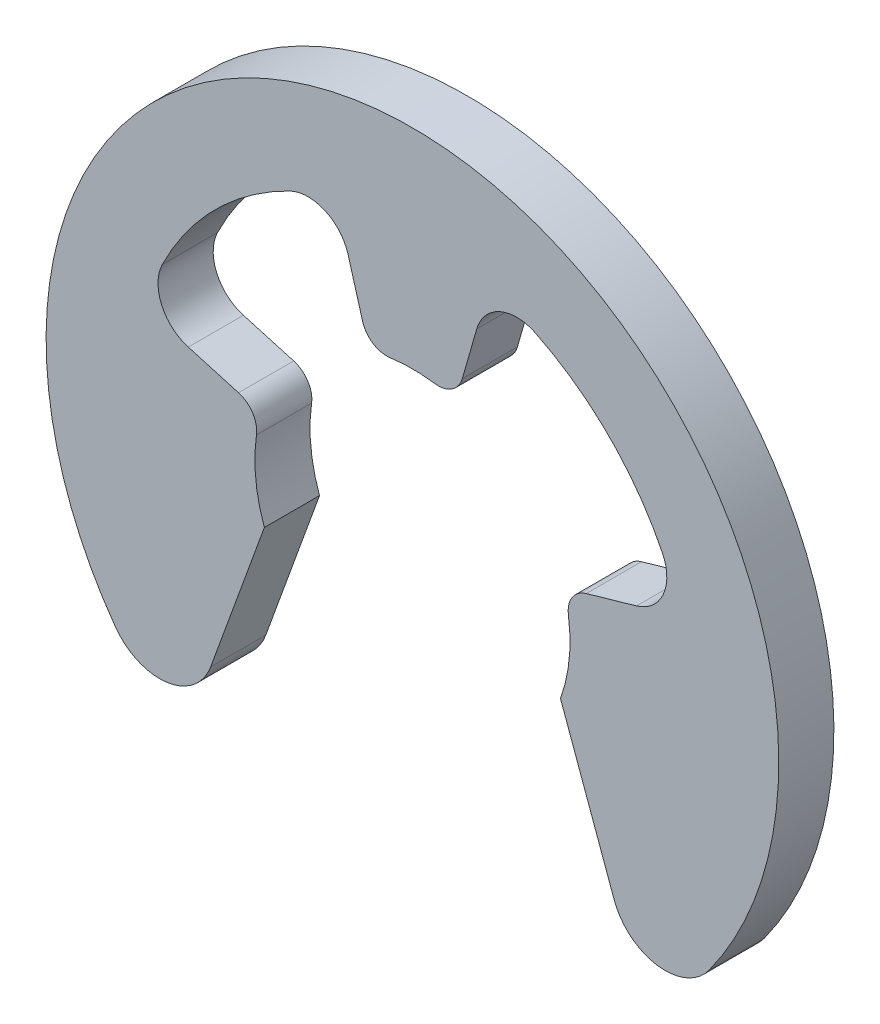
ISO-10303-21;
HEADER;
FILE_DESCRIPTION(('STEP AP214'),'2;1');
FILE_NAME('part.step','',(''),(''),'','','');
FILE_SCHEMA(('AUTOMOTIVE_DESIGN { 1 0 10303 214 1 1 1 1 }'));
ENDSEC;
DATA;
#1=APPLICATION_CONTEXT('core data for automotive mechanical design processes');
#2=APPLICATION_PROTOCOL_DEFINITION('international standard','automotive_design',2000,#1);
#3=PRODUCT_CONTEXT('',#1,'mechanical');
#4=PRODUCT('Part','Part','',(#3));
#5=PRODUCT_RELATED_PRODUCT_CATEGORY('part','',(#4));
#6=PRODUCT_DEFINITION_FORMATION('','',#4);
#7=PRODUCT_DEFINITION_CONTEXT('part definition',#1,'design');
#8=PRODUCT_DEFINITION('design','',#6,#7);
#9=PRODUCT_DEFINITION_SHAPE('','',#8);
#10=(LENGTH_UNIT() NAMED_UNIT(*) SI_UNIT(.MILLI.,.METRE.));
#11=(NAMED_UNIT(*) PLANE_ANGLE_UNIT() SI_UNIT($,.RADIAN.));
#12=(NAMED_UNIT(*) SI_UNIT($,.STERADIAN.) SOLID_ANGLE_UNIT());
#13=UNCERTAINTY_MEASURE_WITH_UNIT(LENGTH_MEASURE(1.E-05),#10,'distance_accuracy_value','');
#14=(GEOMETRIC_REPRESENTATION_CONTEXT(3) GLOBAL_UNCERTAINTY_ASSIGNED_CONTEXT((#13)) GLOBAL_UNIT_ASSIGNED_CONTEXT((#10,
#11,#12)) REPRESENTATION_CONTEXT('',''));
#15=CARTESIAN_POINT('',(0.,0.,0.));
#16=DIRECTION('',(0.,0.,1.));
#17=DIRECTION('',(1.,0.,0.));
#18=AXIS2_PLACEMENT_3D('',#15,#16,#17);
#19=CARTESIAN_POINT('',(0.,0.,0.));
#20=DIRECTION('',(0.,0.,1.));
#21=DIRECTION('',(1.,0.,0.));
#22=AXIS2_PLACEMENT_3D('',#19,#20,#21);
#23=CYLINDRICAL_SURFACE('',#22,2.);
#24=CARTESIAN_POINT('',(0.,0.,0.7));
#25=DIRECTION('',(0.,0.,-1.));
#26=DIRECTION('',(-1.,0.,0.));
#27=AXIS2_PLACEMENT_3D('',#24,#25,#26);
#28=CIRCLE('',#27,2.);
#29=CARTESIAN_POINT('',(-0.282316824021943,1.9799740429799,0.7));
#30=VERTEX_POINT('',#29);
#31=CARTESIAN_POINT('',(0.282316824021944,1.9799740429799,0.7));
#32=VERTEX_POINT('',#31);
#33=EDGE_CURVE('E216',#30,#32,#28,.T.);
#34=ORIENTED_EDGE('',*,*,#33,.F.);
#35=DIRECTION('',(0.,0.,1.));
#36=VECTOR('',#35,1.);
#37=CARTESIAN_POINT('',(-0.282316824021943,1.9799740429799,0.));
#38=LINE('',#37,#36);
#39=CARTESIAN_POINT('',(-0.282316824021943,1.9799740429799,0.));
#40=VERTEX_POINT('',#39);
#41=EDGE_CURVE('E11',#40,#30,#38,.T.);
#42=ORIENTED_EDGE('',*,*,#41,.F.);
#43=CARTESIAN_POINT('',(0.,0.,0.));
#44=DIRECTION('',(0.,0.,-1.));
#45=DIRECTION('',(-1.,0.,0.));
#46=AXIS2_PLACEMENT_3D('',#43,#44,#45);
#47=CIRCLE('',#46,2.);
#48=CARTESIAN_POINT('',(0.282316824021944,1.9799740429799,0.));
#49=VERTEX_POINT('',#48);
#50=EDGE_CURVE('E278',#40,#49,#47,.T.);
#51=ORIENTED_EDGE('',*,*,#50,.T.);
#52=DIRECTION('',(0.,0.,1.));
#53=VECTOR('',#52,1.);
#54=CARTESIAN_POINT('',(0.282316824021944,1.9799740429799,0.));
#55=LINE('',#54,#53);
#56=EDGE_CURVE('E38',#49,#32,#55,.T.);
#57=ORIENTED_EDGE('',*,*,#56,.T.);
#58=EDGE_LOOP('',(#34,#42,#51,#57));
#59=FACE_BOUND('',#58,.T.);
#60=ADVANCED_FACE('F35',(#59),#23,.F.);
#61=CARTESIAN_POINT('',(-0.327205199041433,2.2947899158137,0.));
#62=DIRECTION('',(0.,0.,1.));
#63=DIRECTION('',(1.,0.,0.));
#64=AXIS2_PLACEMENT_3D('',#61,#62,#63);
#65=CYLINDRICAL_SURFACE('',#64,0.317999999999998);
#66=CARTESIAN_POINT('',(-0.327205199041433,2.2947899158137,0.7));
#67=DIRECTION('',(0.,0.,1.));
#68=DIRECTION('',(1.,0.,0.));
#69=AXIS2_PLACEMENT_3D('',#66,#67,#68);
#70=CIRCLE('',#69,0.317999999999998);
#71=CARTESIAN_POINT('',(-0.632886418349818,2.2071372366639,0.7));
#72=VERTEX_POINT('',#71);
#73=EDGE_CURVE('E276',#72,#30,#70,.T.);
#74=ORIENTED_EDGE('',*,*,#73,.F.);
#75=DIRECTION('',(0.,0.,1.));
#76=VECTOR('',#75,1.);
#77=CARTESIAN_POINT('',(-0.632886418349818,2.2071372366639,0.));
#78=LINE('',#77,#76);
#79=CARTESIAN_POINT('',(-0.632886418349818,2.2071372366639,0.));
#80=VERTEX_POINT('',#79);
#81=EDGE_CURVE('E44',#80,#72,#78,.T.);
#82=ORIENTED_EDGE('',*,*,#81,.F.);
#83=CARTESIAN_POINT('',(-0.327205199041433,2.2947899158137,0.));
#84=DIRECTION('',(0.,0.,1.));
#85=DIRECTION('',(1.,0.,0.));
#86=AXIS2_PLACEMENT_3D('',#83,#84,#85);
#87=CIRCLE('',#86,0.317999999999998);
#88=EDGE_CURVE('E206',#80,#40,#87,.T.);
#89=ORIENTED_EDGE('',*,*,#88,.T.);
#90=ORIENTED_EDGE('',*,*,#41,.T.);
#91=EDGE_LOOP('',(#74,#82,#89,#90));
#92=FACE_BOUND('',#91,.T.);
#93=ADVANCED_FACE('F318',(#92),#65,.T.);
#94=CARTESIAN_POINT('',(-0.815865574223849,2.84526138778081,0.));
#95=DIRECTION('',(-0.961261695938319,-0.275637355816998,0.));
#96=DIRECTION('',(0.275637355816998,-0.961261695938319,0.));
#97=AXIS2_PLACEMENT_3D('',#94,#95,#96);
#98=PLANE('',#97);
#99=DIRECTION('',(0.275637355816998,-0.961261695938319,0.));
#100=VECTOR('',#99,1.);
#101=CARTESIAN_POINT('',(-0.815865574223849,2.84526138778081,0.7));
#102=LINE('',#101,#100);
#103=CARTESIAN_POINT('',(-0.815865574223848,2.84526138778081,0.7));
#104=VERTEX_POINT('',#103);
#105=EDGE_CURVE('E193',#104,#72,#102,.T.);
#106=ORIENTED_EDGE('',*,*,#105,.F.);
#107=DIRECTION('',(0.,0.,1.));
#108=VECTOR('',#107,1.);
#109=CARTESIAN_POINT('',(-0.815865574223848,2.84526138778081,0.));
#110=LINE('',#109,#108);
#111=CARTESIAN_POINT('',(-0.815865574223848,2.84526138778081,0.));
#112=VERTEX_POINT('',#111);
#113=EDGE_CURVE('E188',#112,#104,#110,.T.);
#114=ORIENTED_EDGE('',*,*,#113,.F.);
#115=DIRECTION('',(0.275637355816998,-0.961261695938319,0.));
#116=VECTOR('',#115,1.);
#117=CARTESIAN_POINT('',(-0.815865574223849,2.84526138778081,0.));
#118=LINE('',#117,#116);
#119=EDGE_CURVE('E191',#112,#80,#118,.T.);
#120=ORIENTED_EDGE('',*,*,#119,.T.);
#121=ORIENTED_EDGE('',*,*,#81,.T.);
#122=EDGE_LOOP('',(#106,#114,#120,#121));
#123=FACE_BOUND('',#122,.T.);
#124=ADVANCED_FACE('F190',(#123),#98,.T.);
#125=CARTESIAN_POINT('',(-1.32533427307116,2.6991735891978,0.));
#126=DIRECTION('',(0.,0.,1.));
#127=DIRECTION('',(1.,0.,0.));
#128=AXIS2_PLACEMENT_3D('',#125,#126,#127);
#129=CYLINDRICAL_SURFACE('',#128,0.530000000000002);
#130=CARTESIAN_POINT('',(-1.32533427307116,2.6991735891978,0.7));
#131=DIRECTION('',(0.,0.,-1.));
#132=DIRECTION('',(-1.,0.,0.));
#133=AXIS2_PLACEMENT_3D('',#130,#131,#132);
#134=CIRCLE('',#133,0.530000000000002);
#135=CARTESIAN_POINT('',(-1.55893160088217,3.17491752078238,0.7));
#136=VERTEX_POINT('',#135);
#137=EDGE_CURVE('E273',#136,#104,#134,.T.);
#138=ORIENTED_EDGE('',*,*,#137,.F.);
#139=DIRECTION('',(0.,0.,1.));
#140=VECTOR('',#139,1.);
#141=CARTESIAN_POINT('',(-1.55893160088217,3.17491752078238,0.));
#142=LINE('',#141,#140);
#143=CARTESIAN_POINT('',(-1.55893160088217,3.17491752078238,0.));
#144=VERTEX_POINT('',#143);
#145=EDGE_CURVE('E198',#144,#136,#142,.T.);
#146=ORIENTED_EDGE('',*,*,#145,.F.);
#147=CARTESIAN_POINT('',(-1.32533427307116,2.6991735891978,0.));
#148=DIRECTION('',(0.,0.,-1.));
#149=DIRECTION('',(-1.,0.,0.));
#150=AXIS2_PLACEMENT_3D('',#147,#148,#149);
#151=CIRCLE('',#150,0.530000000000002);
#152=EDGE_CURVE('E204',#144,#112,#151,.T.);
#153=ORIENTED_EDGE('',*,*,#152,.T.);
#154=ORIENTED_EDGE('',*,*,#113,.T.);
#155=EDGE_LOOP('',(#138,#146,#153,#154));
#156=FACE_BOUND('',#155,.T.);
#157=ADVANCED_FACE('F208',(#156),#129,.F.);
#158=CARTESIAN_POINT('',(0.,0.,0.));
#159=DIRECTION('',(0.,0.,1.));
#160=DIRECTION('',(1.,0.,0.));
#161=AXIS2_PLACEMENT_3D('',#158,#159,#160);
#162=CYLINDRICAL_SURFACE('',#161,3.537);
#163=CARTESIAN_POINT('',(0.,0.,0.7));
#164=DIRECTION('',(0.,0.,-1.));
#165=DIRECTION('',(-1.,0.,0.));
#166=AXIS2_PLACEMENT_3D('',#163,#164,#165);
#167=CIRCLE('',#166,3.537);
#168=CARTESIAN_POINT('',(-3.17491752078238,1.55893160088217,0.7));
#169=VERTEX_POINT('',#168);
#170=EDGE_CURVE('E270',#169,#136,#167,.T.);
#171=ORIENTED_EDGE('',*,*,#170,.F.);
#172=DIRECTION('',(0.,0.,1.));
#173=VECTOR('',#172,1.);
#174=CARTESIAN_POINT('',(-3.17491752078238,1.55893160088217,0.));
#175=LINE('',#174,#173);
#176=CARTESIAN_POINT('',(-3.17491752078238,1.55893160088217,0.));
#177=VERTEX_POINT('',#176);
#178=EDGE_CURVE('E282',#177,#169,#175,.T.);
#179=ORIENTED_EDGE('',*,*,#178,.F.);
#180=CARTESIAN_POINT('',(0.,0.,0.));
#181=DIRECTION('',(0.,0.,-1.));
#182=DIRECTION('',(-1.,0.,0.));
#183=AXIS2_PLACEMENT_3D('',#180,#181,#182);
#184=CIRCLE('',#183,3.537);
#185=EDGE_CURVE('E209',#177,#144,#184,.T.);
#186=ORIENTED_EDGE('',*,*,#185,.T.);
#187=ORIENTED_EDGE('',*,*,#145,.T.);
#188=EDGE_LOOP('',(#171,#179,#186,#187));
#189=FACE_BOUND('',#188,.T.);
#190=ADVANCED_FACE('F331',(#189),#162,.F.);
#191=CARTESIAN_POINT('',(-2.6991735891978,1.32533427307116,0.));
#192=DIRECTION('',(0.,0.,1.));
#193=DIRECTION('',(1.,0.,0.));
#194=AXIS2_PLACEMENT_3D('',#191,#192,#193);
#195=CYLINDRICAL_SURFACE('',#194,0.530000000000001);
#196=CARTESIAN_POINT('',(-2.6991735891978,1.32533427307116,0.7));
#197=DIRECTION('',(0.,0.,-1.));
#198=DIRECTION('',(-1.,0.,0.));
#199=AXIS2_PLACEMENT_3D('',#196,#197,#198);
#200=CIRCLE('',#199,0.530000000000001);
#201=CARTESIAN_POINT('',(-2.84526138778081,0.815865574223851,0.7));
#202=VERTEX_POINT('',#201);
#203=EDGE_CURVE('E267',#202,#169,#200,.T.);
#204=ORIENTED_EDGE('',*,*,#203,.F.);
#205=DIRECTION('',(0.,0.,1.));
#206=VECTOR('',#205,1.);
#207=CARTESIAN_POINT('',(-2.84526138778081,0.815865574223851,0.));
#208=LINE('',#207,#206);
#209=CARTESIAN_POINT('',(-2.84526138778081,0.815865574223851,0.));
#210=VERTEX_POINT('',#209);
#211=EDGE_CURVE('E284',#210,#202,#208,.T.);
#212=ORIENTED_EDGE('',*,*,#211,.F.);
#213=CARTESIAN_POINT('',(-2.6991735891978,1.32533427307116,0.));
#214=DIRECTION('',(0.,0.,-1.));
#215=DIRECTION('',(-1.,0.,0.));
#216=AXIS2_PLACEMENT_3D('',#213,#214,#215);
#217=CIRCLE('',#216,0.530000000000001);
#218=EDGE_CURVE('E211',#210,#177,#217,.T.);
#219=ORIENTED_EDGE('',*,*,#218,.T.);
#220=ORIENTED_EDGE('',*,*,#178,.T.);
#221=EDGE_LOOP('',(#204,#212,#219,#220));
#222=FACE_BOUND('',#221,.T.);
#223=ADVANCED_FACE('F334',(#222),#195,.F.);
#224=CARTESIAN_POINT('',(-2.2071372366639,0.632886418349818,0.));
#225=DIRECTION('',(0.275637355817001,0.961261695938318,0.));
#226=DIRECTION('',(-0.961261695938318,0.275637355817001,0.));
#227=AXIS2_PLACEMENT_3D('',#224,#225,#226);
#228=PLANE('',#227);
#229=DIRECTION('',(-0.961261695938318,0.275637355817001,0.));
#230=VECTOR('',#229,1.);
#231=CARTESIAN_POINT('',(-2.2071372366639,0.632886418349818,0.7));
#232=LINE('',#231,#230);
#233=CARTESIAN_POINT('',(-2.2071372366639,0.632886418349816,0.7));
#234=VERTEX_POINT('',#233);
#235=EDGE_CURVE('E264',#234,#202,#232,.T.);
#236=ORIENTED_EDGE('',*,*,#235,.F.);
#237=DIRECTION('',(0.,0.,1.));
#238=VECTOR('',#237,1.);
#239=CARTESIAN_POINT('',(-2.2071372366639,0.632886418349816,0.));
#240=LINE('',#239,#238);
#241=CARTESIAN_POINT('',(-2.2071372366639,0.632886418349816,0.));
#242=VERTEX_POINT('',#241);
#243=EDGE_CURVE('E286',#242,#234,#240,.T.);
#244=ORIENTED_EDGE('',*,*,#243,.F.);
#245=DIRECTION('',(-0.961261695938318,0.275637355817001,0.));
#246=VECTOR('',#245,1.);
#247=CARTESIAN_POINT('',(-2.2071372366639,0.632886418349818,0.));
#248=LINE('',#247,#246);
#249=EDGE_CURVE('E597',#242,#210,#248,.T.);
#250=ORIENTED_EDGE('',*,*,#249,.T.);
#251=ORIENTED_EDGE('',*,*,#211,.T.);
#252=EDGE_LOOP('',(#236,#244,#250,#251));
#253=FACE_BOUND('',#252,.T.);
#254=ADVANCED_FACE('F338',(#253),#228,.T.);
#255=CARTESIAN_POINT('',(-2.2947899158137,0.327205199041433,0.));
#256=DIRECTION('',(0.,0.,1.));
#257=DIRECTION('',(1.,0.,0.));
#258=AXIS2_PLACEMENT_3D('',#255,#256,#257);
#259=CYLINDRICAL_SURFACE('',#258,0.317999999999998);
#260=CARTESIAN_POINT('',(-2.2947899158137,0.327205199041433,0.7));
#261=DIRECTION('',(0.,0.,1.));
#262=DIRECTION('',(1.,0.,0.));
#263=AXIS2_PLACEMENT_3D('',#260,#261,#262);
#264=CIRCLE('',#263,0.317999999999998);
#265=CARTESIAN_POINT('',(-1.9799740429799,0.282316824021944,0.7));
#266=VERTEX_POINT('',#265);
#267=EDGE_CURVE('E261',#266,#234,#264,.T.);
#268=ORIENTED_EDGE('',*,*,#267,.F.);
#269=DIRECTION('',(0.,0.,1.));
#270=VECTOR('',#269,1.);
#271=CARTESIAN_POINT('',(-1.9799740429799,0.282316824021944,0.));
#272=LINE('',#271,#270);
#273=CARTESIAN_POINT('',(-1.9799740429799,0.282316824021944,0.));
#274=VERTEX_POINT('',#273);
#275=EDGE_CURVE('E288',#274,#266,#272,.T.);
#276=ORIENTED_EDGE('',*,*,#275,.F.);
#277=CARTESIAN_POINT('',(-2.2947899158137,0.327205199041433,0.));
#278=DIRECTION('',(0.,0.,1.));
#279=DIRECTION('',(1.,0.,0.));
#280=AXIS2_PLACEMENT_3D('',#277,#278,#279);
#281=CIRCLE('',#280,0.317999999999998);
#282=EDGE_CURVE('E593',#274,#242,#281,.T.);
#283=ORIENTED_EDGE('',*,*,#282,.T.);
#284=ORIENTED_EDGE('',*,*,#243,.T.);
#285=EDGE_LOOP('',(#268,#276,#283,#284));
#286=FACE_BOUND('',#285,.T.);
#287=ADVANCED_FACE('F342',(#286),#259,.T.);
#288=CARTESIAN_POINT('',(0.,0.,0.));
#289=DIRECTION('',(0.,0.,1.));
#290=DIRECTION('',(1.,0.,0.));
#291=AXIS2_PLACEMENT_3D('',#288,#289,#290);
#292=CYLINDRICAL_SURFACE('',#291,2.);
#293=CARTESIAN_POINT('',(0.,0.,0.7));
#294=DIRECTION('',(0.,0.,-1.));
#295=DIRECTION('',(-1.,0.,0.));
#296=AXIS2_PLACEMENT_3D('',#293,#294,#295);
#297=CIRCLE('',#296,2.);
#298=CARTESIAN_POINT('',(-1.87938524157182,-0.684040286651338,0.7));
#299=VERTEX_POINT('',#298);
#300=EDGE_CURVE('E258',#299,#266,#297,.T.);
#301=ORIENTED_EDGE('',*,*,#300,.F.);
#302=DIRECTION('',(0.,0.,1.));
#303=VECTOR('',#302,1.);
#304=CARTESIAN_POINT('',(-1.87938524157182,-0.684040286651338,0.));
#305=LINE('',#304,#303);
#306=CARTESIAN_POINT('',(-1.87938524157182,-0.684040286651338,0.));
#307=VERTEX_POINT('',#306);
#308=EDGE_CURVE('E290',#307,#299,#305,.T.);
#309=ORIENTED_EDGE('',*,*,#308,.F.);
#310=CARTESIAN_POINT('',(0.,0.,0.));
#311=DIRECTION('',(0.,0.,-1.));
#312=DIRECTION('',(-1.,0.,0.));
#313=AXIS2_PLACEMENT_3D('',#310,#311,#312);
#314=CIRCLE('',#313,2.);
#315=EDGE_CURVE('E604',#307,#274,#314,.T.);
#316=ORIENTED_EDGE('',*,*,#315,.T.);
#317=ORIENTED_EDGE('',*,*,#275,.T.);
#318=EDGE_LOOP('',(#301,#309,#316,#317));
#319=FACE_BOUND('',#318,.T.);
#320=ADVANCED_FACE('F346',(#319),#292,.F.);
#321=CARTESIAN_POINT('',(-2.56140842357323,-2.55788357874478,0.));
#322=DIRECTION('',(0.939692620785907,-0.342020143325672,0.));
#323=DIRECTION('',(0.342020143325672,0.939692620785907,0.));
#324=AXIS2_PLACEMENT_3D('',#321,#322,#323);
#325=PLANE('',#324);
#326=DIRECTION('',(0.342020143325671,0.939692620785907,0.));
#327=VECTOR('',#326,1.);
#328=CARTESIAN_POINT('',(-2.56140842357323,-2.55788357874478,0.7));
#329=LINE('',#328,#327);
#330=CARTESIAN_POINT('',(-2.56140842357322,-2.55788357874478,0.7));
#331=VERTEX_POINT('',#330);
#332=EDGE_CURVE('E255',#331,#299,#329,.T.);
#333=ORIENTED_EDGE('',*,*,#332,.F.);
#334=DIRECTION('',(0.,0.,1.));
#335=VECTOR('',#334,1.);
#336=CARTESIAN_POINT('',(-2.56140842357322,-2.55788357874478,0.));
#337=LINE('',#336,#335);
#338=CARTESIAN_POINT('',(-2.56140842357322,-2.55788357874478,0.));
#339=VERTEX_POINT('',#338);
#340=EDGE_CURVE('E292',#339,#331,#337,.T.);
#341=ORIENTED_EDGE('',*,*,#340,.F.);
#342=DIRECTION('',(0.342020143325671,0.939692620785907,0.));
#343=VECTOR('',#342,1.);
#344=CARTESIAN_POINT('',(-2.56140842357323,-2.55788357874478,0.));
#345=LINE('',#344,#343);
#346=EDGE_CURVE('E586',#339,#307,#345,.T.);
#347=ORIENTED_EDGE('',*,*,#346,.T.);
#348=ORIENTED_EDGE('',*,*,#308,.T.);
#349=EDGE_LOOP('',(#333,#341,#347,#348));
#350=FACE_BOUND('',#349,.T.);
#351=ADVANCED_FACE('F350',(#350),#325,.T.);
#352=CARTESIAN_POINT('',(-3.20885663929472,-2.3222316999934,0.));
#353=DIRECTION('',(0.,0.,1.));
#354=DIRECTION('',(1.,0.,0.));
#355=AXIS2_PLACEMENT_3D('',#352,#353,#354);
#356=CYLINDRICAL_SURFACE('',#355,0.689);
#357=CARTESIAN_POINT('',(-3.20885663929472,-2.3222316999934,0.7));
#358=DIRECTION('',(0.,0.,1.));
#359=DIRECTION('',(1.,0.,0.));
#360=AXIS2_PLACEMENT_3D('',#357,#358,#359);
#361=CIRCLE('',#360,0.689);
#362=CARTESIAN_POINT('',(-3.76702433040152,-2.7261745531354,0.7));
#363=VERTEX_POINT('',#362);
#364=EDGE_CURVE('E252',#363,#331,#361,.T.);
#365=ORIENTED_EDGE('',*,*,#364,.F.);
#366=DIRECTION('',(0.,0.,1.));
#367=VECTOR('',#366,1.);
#368=CARTESIAN_POINT('',(-3.76702433040152,-2.7261745531354,0.));
#369=LINE('',#368,#367);
#370=CARTESIAN_POINT('',(-3.76702433040152,-2.7261745531354,0.));
#371=VERTEX_POINT('',#370);
#372=EDGE_CURVE('E294',#371,#363,#369,.T.);
#373=ORIENTED_EDGE('',*,*,#372,.F.);
#374=CARTESIAN_POINT('',(-3.20885663929472,-2.3222316999934,0.));
#375=DIRECTION('',(0.,0.,1.));
#376=DIRECTION('',(1.,0.,0.));
#377=AXIS2_PLACEMENT_3D('',#374,#375,#376);
#378=CIRCLE('',#377,0.689);
#379=EDGE_CURVE('E582',#371,#339,#378,.T.);
#380=ORIENTED_EDGE('',*,*,#379,.T.);
#381=ORIENTED_EDGE('',*,*,#340,.T.);
#382=EDGE_LOOP('',(#365,#373,#380,#381));
#383=FACE_BOUND('',#382,.T.);
#384=ADVANCED_FACE('F354',(#383),#356,.T.);
#385=CARTESIAN_POINT('',(0.,0.,0.));
#386=DIRECTION('',(0.,0.,1.));
#387=DIRECTION('',(1.,0.,0.));
#388=AXIS2_PLACEMENT_3D('',#385,#386,#387);
#389=CYLINDRICAL_SURFACE('',#388,4.65);
#390=CARTESIAN_POINT('',(0.,0.,0.7));
#391=DIRECTION('',(0.,0.,1.));
#392=DIRECTION('',(1.,0.,0.));
#393=AXIS2_PLACEMENT_3D('',#390,#391,#392);
#394=CIRCLE('',#393,4.65);
#395=CARTESIAN_POINT('',(3.76702433040152,-2.7261745531354,0.7));
#396=VERTEX_POINT('',#395);
#397=EDGE_CURVE('E249',#396,#363,#394,.T.);
#398=ORIENTED_EDGE('',*,*,#397,.F.);
#399=DIRECTION('',(0.,0.,1.));
#400=VECTOR('',#399,1.);
#401=CARTESIAN_POINT('',(3.76702433040152,-2.7261745531354,0.));
#402=LINE('',#401,#400);
#403=CARTESIAN_POINT('',(3.76702433040152,-2.7261745531354,0.));
#404=VERTEX_POINT('',#403);
#405=EDGE_CURVE('E296',#404,#396,#402,.T.);
#406=ORIENTED_EDGE('',*,*,#405,.F.);
#407=CARTESIAN_POINT('',(0.,0.,0.));
#408=DIRECTION('',(0.,0.,1.));
#409=DIRECTION('',(1.,0.,0.));
#410=AXIS2_PLACEMENT_3D('',#407,#408,#409);
#411=CIRCLE('',#410,4.65);
#412=EDGE_CURVE('E608',#404,#371,#411,.T.);
#413=ORIENTED_EDGE('',*,*,#412,.T.);
#414=ORIENTED_EDGE('',*,*,#372,.T.);
#415=EDGE_LOOP('',(#398,#406,#413,#414));
#416=FACE_BOUND('',#415,.T.);
#417=ADVANCED_FACE('F358',(#416),#389,.T.);
#418=CARTESIAN_POINT('',(3.20885663929472,-2.3222316999934,0.));
#419=DIRECTION('',(0.,0.,1.));
#420=DIRECTION('',(1.,0.,0.));
#421=AXIS2_PLACEMENT_3D('',#418,#419,#420);
#422=CYLINDRICAL_SURFACE('',#421,0.689);
#423=CARTESIAN_POINT('',(3.20885663929472,-2.3222316999934,0.7));
#424=DIRECTION('',(0.,0.,1.));
#425=DIRECTION('',(1.,0.,0.));
#426=AXIS2_PLACEMENT_3D('',#423,#424,#425);
#427=CIRCLE('',#426,0.689);
#428=CARTESIAN_POINT('',(2.56140842357323,-2.55788357874478,0.7));
#429=VERTEX_POINT('',#428);
#430=EDGE_CURVE('E246',#429,#396,#427,.T.);
#431=ORIENTED_EDGE('',*,*,#430,.F.);
#432=DIRECTION('',(0.,0.,1.));
#433=VECTOR('',#432,1.);
#434=CARTESIAN_POINT('',(2.56140842357323,-2.55788357874478,0.));
#435=LINE('',#434,#433);
#436=CARTESIAN_POINT('',(2.56140842357323,-2.55788357874478,0.));
#437=VERTEX_POINT('',#436);
#438=EDGE_CURVE('E298',#437,#429,#435,.T.);
#439=ORIENTED_EDGE('',*,*,#438,.F.);
#440=CARTESIAN_POINT('',(3.20885663929472,-2.3222316999934,0.));
#441=DIRECTION('',(0.,0.,1.));
#442=DIRECTION('',(1.,0.,0.));
#443=AXIS2_PLACEMENT_3D('',#440,#441,#442);
#444=CIRCLE('',#443,0.689);
#445=EDGE_CURVE('E575',#437,#404,#444,.T.);
#446=ORIENTED_EDGE('',*,*,#445,.T.);
#447=ORIENTED_EDGE('',*,*,#405,.T.);
#448=EDGE_LOOP('',(#431,#439,#446,#447));
#449=FACE_BOUND('',#448,.T.);
#450=ADVANCED_FACE('F362',(#449),#422,.T.);
#451=CARTESIAN_POINT('',(1.87938524157182,-0.684040286651337,0.));
#452=DIRECTION('',(-0.939692620785907,-0.342020143325671,0.));
#453=DIRECTION('',(0.342020143325671,-0.939692620785908,0.));
#454=AXIS2_PLACEMENT_3D('',#451,#452,#453);
#455=PLANE('',#454);
#456=DIRECTION('',(0.342020143325671,-0.939692620785907,0.));
#457=VECTOR('',#456,1.);
#458=CARTESIAN_POINT('',(1.87938524157182,-0.684040286651337,0.7));
#459=LINE('',#458,#457);
#460=CARTESIAN_POINT('',(1.87938524157182,-0.684040286651337,0.7));
#461=VERTEX_POINT('',#460);
#462=EDGE_CURVE('E243',#461,#429,#459,.T.);
#463=ORIENTED_EDGE('',*,*,#462,.F.);
#464=DIRECTION('',(0.,0.,1.));
#465=VECTOR('',#464,1.);
#466=CARTESIAN_POINT('',(1.87938524157182,-0.684040286651337,0.));
#467=LINE('',#466,#465);
#468=CARTESIAN_POINT('',(1.87938524157182,-0.684040286651337,0.));
#469=VERTEX_POINT('',#468);
#470=EDGE_CURVE('E300',#469,#461,#467,.T.);
#471=ORIENTED_EDGE('',*,*,#470,.F.);
#472=DIRECTION('',(0.342020143325671,-0.939692620785907,0.));
#473=VECTOR('',#472,1.);
#474=CARTESIAN_POINT('',(1.87938524157182,-0.684040286651337,0.));
#475=LINE('',#474,#473);
#476=EDGE_CURVE('E571',#469,#437,#475,.T.);
#477=ORIENTED_EDGE('',*,*,#476,.T.);
#478=ORIENTED_EDGE('',*,*,#438,.T.);
#479=EDGE_LOOP('',(#463,#471,#477,#478));
#480=FACE_BOUND('',#479,.T.);
#481=ADVANCED_FACE('F366',(#480),#455,.T.);
#482=CARTESIAN_POINT('',(0.,0.,0.));
#483=DIRECTION('',(0.,0.,1.));
#484=DIRECTION('',(1.,0.,0.));
#485=AXIS2_PLACEMENT_3D('',#482,#483,#484);
#486=CYLINDRICAL_SURFACE('',#485,2.);
#487=CARTESIAN_POINT('',(0.,0.,0.7));
#488=DIRECTION('',(0.,0.,-1.));
#489=DIRECTION('',(-1.,0.,0.));
#490=AXIS2_PLACEMENT_3D('',#487,#488,#489);
#491=CIRCLE('',#490,2.);
#492=CARTESIAN_POINT('',(1.9799740429799,0.282316824021943,0.7));
#493=VERTEX_POINT('',#492);
#494=EDGE_CURVE('E240',#493,#461,#491,.T.);
#495=ORIENTED_EDGE('',*,*,#494,.F.);
#496=DIRECTION('',(0.,0.,1.));
#497=VECTOR('',#496,1.);
#498=CARTESIAN_POINT('',(1.9799740429799,0.282316824021943,0.));
#499=LINE('',#498,#497);
#500=CARTESIAN_POINT('',(1.9799740429799,0.282316824021943,0.));
#501=VERTEX_POINT('',#500);
#502=EDGE_CURVE('E302',#501,#493,#499,.T.);
#503=ORIENTED_EDGE('',*,*,#502,.F.);
#504=CARTESIAN_POINT('',(0.,0.,0.));
#505=DIRECTION('',(0.,0.,-1.));
#506=DIRECTION('',(-1.,0.,0.));
#507=AXIS2_PLACEMENT_3D('',#504,#505,#506);
#508=CIRCLE('',#507,2.);
#509=EDGE_CURVE('E612',#501,#469,#508,.T.);
#510=ORIENTED_EDGE('',*,*,#509,.T.);
#511=ORIENTED_EDGE('',*,*,#470,.T.);
#512=EDGE_LOOP('',(#495,#503,#510,#511));
#513=FACE_BOUND('',#512,.T.);
#514=ADVANCED_FACE('F370',(#513),#486,.F.);
#515=CARTESIAN_POINT('',(2.2947899158137,0.327205199041433,0.));
#516=DIRECTION('',(0.,0.,1.));
#517=DIRECTION('',(1.,0.,0.));
#518=AXIS2_PLACEMENT_3D('',#515,#516,#517);
#519=CYLINDRICAL_SURFACE('',#518,0.317999999999998);
#520=CARTESIAN_POINT('',(2.2947899158137,0.327205199041433,0.7));
#521=DIRECTION('',(0.,0.,1.));
#522=DIRECTION('',(1.,0.,0.));
#523=AXIS2_PLACEMENT_3D('',#520,#521,#522);
#524=CIRCLE('',#523,0.317999999999998);
#525=CARTESIAN_POINT('',(2.2071372366639,0.632886418349818,0.7));
#526=VERTEX_POINT('',#525);
#527=EDGE_CURVE('E237',#526,#493,#524,.T.);
#528=ORIENTED_EDGE('',*,*,#527,.F.);
#529=DIRECTION('',(0.,0.,1.));
#530=VECTOR('',#529,1.);
#531=CARTESIAN_POINT('',(2.2071372366639,0.632886418349818,0.));
#532=LINE('',#531,#530);
#533=CARTESIAN_POINT('',(2.2071372366639,0.632886418349818,0.));
#534=VERTEX_POINT('',#533);
#535=EDGE_CURVE('E304',#534,#526,#532,.T.);
#536=ORIENTED_EDGE('',*,*,#535,.F.);
#537=CARTESIAN_POINT('',(2.2947899158137,0.327205199041433,0.));
#538=DIRECTION('',(0.,0.,1.));
#539=DIRECTION('',(1.,0.,0.));
#540=AXIS2_PLACEMENT_3D('',#537,#538,#539);
#541=CIRCLE('',#540,0.317999999999998);
#542=EDGE_CURVE('E564',#534,#501,#541,.T.);
#543=ORIENTED_EDGE('',*,*,#542,.T.);
#544=ORIENTED_EDGE('',*,*,#502,.T.);
#545=EDGE_LOOP('',(#528,#536,#543,#544));
#546=FACE_BOUND('',#545,.T.);
#547=ADVANCED_FACE('F374',(#546),#519,.T.);
#548=CARTESIAN_POINT('',(2.84526138778081,0.815865574223849,0.));
#549=DIRECTION('',(-0.275637355816998,0.961261695938319,0.));
#550=DIRECTION('',(-0.961261695938319,-0.275637355816998,0.));
#551=AXIS2_PLACEMENT_3D('',#548,#549,#550);
#552=PLANE('',#551);
#553=DIRECTION('',(-0.961261695938319,-0.275637355816998,0.));
#554=VECTOR('',#553,1.);
#555=CARTESIAN_POINT('',(2.84526138778081,0.815865574223849,0.7));
#556=LINE('',#555,#554);
#557=CARTESIAN_POINT('',(2.84526138778081,0.815865574223849,0.7));
#558=VERTEX_POINT('',#557);
#559=EDGE_CURVE('E234',#558,#526,#556,.T.);
#560=ORIENTED_EDGE('',*,*,#559,.F.);
#561=DIRECTION('',(0.,0.,1.));
#562=VECTOR('',#561,1.);
#563=CARTESIAN_POINT('',(2.84526138778081,0.815865574223849,0.));
#564=LINE('',#563,#562);
#565=CARTESIAN_POINT('',(2.84526138778081,0.815865574223849,0.));
#566=VERTEX_POINT('',#565);
#567=EDGE_CURVE('E306',#566,#558,#564,.T.);
#568=ORIENTED_EDGE('',*,*,#567,.F.);
#569=DIRECTION('',(-0.961261695938319,-0.275637355816998,0.));
#570=VECTOR('',#569,1.);
#571=CARTESIAN_POINT('',(2.84526138778081,0.815865574223849,0.));
#572=LINE('',#571,#570);
#573=EDGE_CURVE('E560',#566,#534,#572,.T.);
#574=ORIENTED_EDGE('',*,*,#573,.T.);
#575=ORIENTED_EDGE('',*,*,#535,.T.);
#576=EDGE_LOOP('',(#560,#568,#574,#575));
#577=FACE_BOUND('',#576,.T.);
#578=ADVANCED_FACE('F378',(#577),#552,.T.);
#579=CARTESIAN_POINT('',(2.6991735891978,1.32533427307116,0.));
#580=DIRECTION('',(0.,0.,1.));
#581=DIRECTION('',(1.,0.,0.));
#582=AXIS2_PLACEMENT_3D('',#579,#580,#581);
#583=CYLINDRICAL_SURFACE('',#582,0.530000000000002);
#584=CARTESIAN_POINT('',(2.6991735891978,1.32533427307116,0.7));
#585=DIRECTION('',(0.,0.,-1.));
#586=DIRECTION('',(-1.,0.,0.));
#587=AXIS2_PLACEMENT_3D('',#584,#585,#586);
#588=CIRCLE('',#587,0.530000000000002);
#589=CARTESIAN_POINT('',(3.17491752078238,1.55893160088217,0.7));
#590=VERTEX_POINT('',#589);
#591=EDGE_CURVE('E231',#590,#558,#588,.T.);
#592=ORIENTED_EDGE('',*,*,#591,.F.);
#593=DIRECTION('',(0.,0.,1.));
#594=VECTOR('',#593,1.);
#595=CARTESIAN_POINT('',(3.17491752078238,1.55893160088217,0.));
#596=LINE('',#595,#594);
#597=CARTESIAN_POINT('',(3.17491752078238,1.55893160088217,0.));
#598=VERTEX_POINT('',#597);
#599=EDGE_CURVE('E308',#598,#590,#596,.T.);
#600=ORIENTED_EDGE('',*,*,#599,.F.);
#601=CARTESIAN_POINT('',(2.6991735891978,1.32533427307116,0.));
#602=DIRECTION('',(0.,0.,-1.));
#603=DIRECTION('',(-1.,0.,0.));
#604=AXIS2_PLACEMENT_3D('',#601,#602,#603);
#605=CIRCLE('',#604,0.530000000000002);
#606=EDGE_CURVE('E616',#598,#566,#605,.T.);
#607=ORIENTED_EDGE('',*,*,#606,.T.);
#608=ORIENTED_EDGE('',*,*,#567,.T.);
#609=EDGE_LOOP('',(#592,#600,#607,#608));
#610=FACE_BOUND('',#609,.T.);
#611=ADVANCED_FACE('F382',(#610),#583,.F.);
#612=CARTESIAN_POINT('',(0.,0.,0.));
#613=DIRECTION('',(0.,0.,1.));
#614=DIRECTION('',(1.,0.,0.));
#615=AXIS2_PLACEMENT_3D('',#612,#613,#614);
#616=CYLINDRICAL_SURFACE('',#615,3.537);
#617=CARTESIAN_POINT('',(0.,0.,0.7));
#618=DIRECTION('',(0.,0.,-1.));
#619=DIRECTION('',(-1.,0.,0.));
#620=AXIS2_PLACEMENT_3D('',#617,#618,#619);
#621=CIRCLE('',#620,3.537);
#622=CARTESIAN_POINT('',(1.55893160088217,3.17491752078238,0.7));
#623=VERTEX_POINT('',#622);
#624=EDGE_CURVE('E228',#623,#590,#621,.T.);
#625=ORIENTED_EDGE('',*,*,#624,.F.);
#626=DIRECTION('',(0.,0.,1.));
#627=VECTOR('',#626,1.);
#628=CARTESIAN_POINT('',(1.55893160088217,3.17491752078238,0.));
#629=LINE('',#628,#627);
#630=CARTESIAN_POINT('',(1.55893160088217,3.17491752078238,0.));
#631=VERTEX_POINT('',#630);
#632=EDGE_CURVE('E310',#631,#623,#629,.T.);
#633=ORIENTED_EDGE('',*,*,#632,.F.);
#634=CARTESIAN_POINT('',(0.,0.,0.));
#635=DIRECTION('',(0.,0.,-1.));
#636=DIRECTION('',(-1.,0.,0.));
#637=AXIS2_PLACEMENT_3D('',#634,#635,#636);
#638=CIRCLE('',#637,3.537);
#639=EDGE_CURVE('E553',#631,#598,#638,.T.);
#640=ORIENTED_EDGE('',*,*,#639,.T.);
#641=ORIENTED_EDGE('',*,*,#599,.T.);
#642=EDGE_LOOP('',(#625,#633,#640,#641));
#643=FACE_BOUND('',#642,.T.);
#644=ADVANCED_FACE('F386',(#643),#616,.F.);
#645=CARTESIAN_POINT('',(1.32533427307116,2.6991735891978,0.));
#646=DIRECTION('',(0.,0.,1.));
#647=DIRECTION('',(1.,0.,0.));
#648=AXIS2_PLACEMENT_3D('',#645,#646,#647);
#649=CYLINDRICAL_SURFACE('',#648,0.530000000000001);
#650=CARTESIAN_POINT('',(1.32533427307116,2.6991735891978,0.7));
#651=DIRECTION('',(0.,0.,-1.));
#652=DIRECTION('',(-1.,0.,0.));
#653=AXIS2_PLACEMENT_3D('',#650,#651,#652);
#654=CIRCLE('',#653,0.530000000000001);
#655=CARTESIAN_POINT('',(0.815865574223851,2.84526138778081,0.7));
#656=VERTEX_POINT('',#655);
#657=EDGE_CURVE('E225',#656,#623,#654,.T.);
#658=ORIENTED_EDGE('',*,*,#657,.F.);
#659=DIRECTION('',(0.,0.,1.));
#660=VECTOR('',#659,1.);
#661=CARTESIAN_POINT('',(0.815865574223851,2.84526138778081,0.));
#662=LINE('',#661,#660);
#663=CARTESIAN_POINT('',(0.815865574223851,2.84526138778081,0.));
#664=VERTEX_POINT('',#663);
#665=EDGE_CURVE('E312',#664,#656,#662,.T.);
#666=ORIENTED_EDGE('',*,*,#665,.F.);
#667=CARTESIAN_POINT('',(1.32533427307116,2.6991735891978,0.));
#668=DIRECTION('',(0.,0.,-1.));
#669=DIRECTION('',(-1.,0.,0.));
#670=AXIS2_PLACEMENT_3D('',#667,#668,#669);
#671=CIRCLE('',#670,0.530000000000001);
#672=EDGE_CURVE('E549',#664,#631,#671,.T.);
#673=ORIENTED_EDGE('',*,*,#672,.T.);
#674=ORIENTED_EDGE('',*,*,#632,.T.);
#675=EDGE_LOOP('',(#658,#666,#673,#674));
#676=FACE_BOUND('',#675,.T.);
#677=ADVANCED_FACE('F390',(#676),#649,.F.);
#678=CARTESIAN_POINT('',(0.632886418349818,2.2071372366639,0.));
#679=DIRECTION('',(0.961261695938318,-0.275637355817001,0.));
#680=DIRECTION('',(0.275637355817001,0.961261695938318,0.));
#681=AXIS2_PLACEMENT_3D('',#678,#679,#680);
#682=PLANE('',#681);
#683=DIRECTION('',(0.275637355817001,0.961261695938318,0.));
#684=VECTOR('',#683,1.);
#685=CARTESIAN_POINT('',(0.632886418349818,2.2071372366639,0.7));
#686=LINE('',#685,#684);
#687=CARTESIAN_POINT('',(0.632886418349816,2.2071372366639,0.7));
#688=VERTEX_POINT('',#687);
#689=EDGE_CURVE('E222',#688,#656,#686,.T.);
#690=ORIENTED_EDGE('',*,*,#689,.F.);
#691=DIRECTION('',(0.,0.,1.));
#692=VECTOR('',#691,1.);
#693=CARTESIAN_POINT('',(0.632886418349816,2.2071372366639,0.));
#694=LINE('',#693,#692);
#695=CARTESIAN_POINT('',(0.632886418349816,2.2071372366639,0.));
#696=VERTEX_POINT('',#695);
#697=EDGE_CURVE('E313',#696,#688,#694,.T.);
#698=ORIENTED_EDGE('',*,*,#697,.F.);
#699=DIRECTION('',(0.275637355817001,0.961261695938318,0.));
#700=VECTOR('',#699,1.);
#701=CARTESIAN_POINT('',(0.632886418349818,2.2071372366639,0.));
#702=LINE('',#701,#700);
#703=EDGE_CURVE('E620',#696,#664,#702,.T.);
#704=ORIENTED_EDGE('',*,*,#703,.T.);
#705=ORIENTED_EDGE('',*,*,#665,.T.);
#706=EDGE_LOOP('',(#690,#698,#704,#705));
#707=FACE_BOUND('',#706,.T.);
#708=ADVANCED_FACE('F394',(#707),#682,.T.);
#709=CARTESIAN_POINT('',(0.327205199041433,2.2947899158137,0.));
#710=DIRECTION('',(0.,0.,1.));
#711=DIRECTION('',(1.,0.,0.));
#712=AXIS2_PLACEMENT_3D('',#709,#710,#711);
#713=CYLINDRICAL_SURFACE('',#712,0.317999999999998);
#714=CARTESIAN_POINT('',(0.327205199041433,2.2947899158137,0.7));
#715=DIRECTION('',(0.,0.,1.));
#716=DIRECTION('',(1.,0.,0.));
#717=AXIS2_PLACEMENT_3D('',#714,#715,#716);
#718=CIRCLE('',#717,0.317999999999998);
#719=EDGE_CURVE('E219',#32,#688,#718,.T.);
#720=ORIENTED_EDGE('',*,*,#719,.F.);
#721=ORIENTED_EDGE('',*,*,#56,.F.);
#722=CARTESIAN_POINT('',(0.327205199041433,2.2947899158137,0.));
#723=DIRECTION('',(0.,0.,1.));
#724=DIRECTION('',(1.,0.,0.));
#725=AXIS2_PLACEMENT_3D('',#722,#723,#724);
#726=CIRCLE('',#725,0.317999999999998);
#727=EDGE_CURVE('E622',#49,#696,#726,.T.);
#728=ORIENTED_EDGE('',*,*,#727,.T.);
#729=ORIENTED_EDGE('',*,*,#697,.T.);
#730=EDGE_LOOP('',(#720,#721,#728,#729));
#731=FACE_BOUND('',#730,.T.);
#732=ADVANCED_FACE('F315',(#731),#713,.T.);
#733=CARTESIAN_POINT('',(0.,0.,0.));
#734=DIRECTION('',(0.,0.,-1.));
#735=DIRECTION('',(-1.,0.,0.));
#736=AXIS2_PLACEMENT_3D('',#733,#734,#735);
#737=PLANE('',#736);
#738=ORIENTED_EDGE('',*,*,#50,.F.);
#739=ORIENTED_EDGE('',*,*,#88,.F.);
#740=ORIENTED_EDGE('',*,*,#119,.F.);
#741=ORIENTED_EDGE('',*,*,#152,.F.);
#742=ORIENTED_EDGE('',*,*,#185,.F.);
#743=ORIENTED_EDGE('',*,*,#218,.F.);
#744=ORIENTED_EDGE('',*,*,#249,.F.);
#745=ORIENTED_EDGE('',*,*,#282,.F.);
#746=ORIENTED_EDGE('',*,*,#315,.F.);
#747=ORIENTED_EDGE('',*,*,#346,.F.);
#748=ORIENTED_EDGE('',*,*,#379,.F.);
#749=ORIENTED_EDGE('',*,*,#412,.F.);
#750=ORIENTED_EDGE('',*,*,#445,.F.);
#751=ORIENTED_EDGE('',*,*,#476,.F.);
#752=ORIENTED_EDGE('',*,*,#509,.F.);
#753=ORIENTED_EDGE('',*,*,#542,.F.);
#754=ORIENTED_EDGE('',*,*,#573,.F.);
#755=ORIENTED_EDGE('',*,*,#606,.F.);
#756=ORIENTED_EDGE('',*,*,#639,.F.);
#757=ORIENTED_EDGE('',*,*,#672,.F.);
#758=ORIENTED_EDGE('',*,*,#703,.F.);
#759=ORIENTED_EDGE('',*,*,#727,.F.);
#760=EDGE_LOOP('',(#738,#739,#740,#741,#742,#743,#744,#745,#746,#747,#748,#749,#750,#751,#752,
#753,#754,#755,#756,#757,#758,#759));
#761=FACE_BOUND('',#760,.T.);
#762=ADVANCED_FACE('F202',(#761),#737,.T.);
#763=CARTESIAN_POINT('',(0.,0.,0.7));
#764=DIRECTION('',(0.,0.,-1.));
#765=DIRECTION('',(-1.,0.,0.));
#766=AXIS2_PLACEMENT_3D('',#763,#764,#765);
#767=PLANE('',#766);
#768=ORIENTED_EDGE('',*,*,#33,.T.);
#769=ORIENTED_EDGE('',*,*,#719,.T.);
#770=ORIENTED_EDGE('',*,*,#689,.T.);
#771=ORIENTED_EDGE('',*,*,#657,.T.);
#772=ORIENTED_EDGE('',*,*,#624,.T.);
#773=ORIENTED_EDGE('',*,*,#591,.T.);
#774=ORIENTED_EDGE('',*,*,#559,.T.);
#775=ORIENTED_EDGE('',*,*,#527,.T.);
#776=ORIENTED_EDGE('',*,*,#494,.T.);
#777=ORIENTED_EDGE('',*,*,#462,.T.);
#778=ORIENTED_EDGE('',*,*,#430,.T.);
#779=ORIENTED_EDGE('',*,*,#397,.T.);
#780=ORIENTED_EDGE('',*,*,#364,.T.);
#781=ORIENTED_EDGE('',*,*,#332,.T.);
#782=ORIENTED_EDGE('',*,*,#300,.T.);
#783=ORIENTED_EDGE('',*,*,#267,.T.);
#784=ORIENTED_EDGE('',*,*,#235,.T.);
#785=ORIENTED_EDGE('',*,*,#203,.T.);
#786=ORIENTED_EDGE('',*,*,#170,.T.);
#787=ORIENTED_EDGE('',*,*,#137,.T.);
#788=ORIENTED_EDGE('',*,*,#105,.T.);
#789=ORIENTED_EDGE('',*,*,#73,.T.);
#790=EDGE_LOOP('',(#768,#769,#770,#771,#772,#773,#774,#775,#776,#777,#778,#779,#780,#781,#782,
#783,#784,#785,#786,#787,#788,#789));
#791=FACE_BOUND('',#790,.T.);
#792=ADVANCED_FACE('F317',(#791),#767,.F.);
#793=CLOSED_SHELL('',(#60,#93,#124,#157,#190,#223,#254,#287,#320,#351,#384,#417,#450,#481,#514,
#547,#578,#611,#644,#677,#708,#732,#762,#792));
#794=MANIFOLD_SOLID_BREP('B2',#793);
#795=ADVANCED_BREP_SHAPE_REPRESENTATION('',(#18,#794),#14);
#796=SHAPE_DEFINITION_REPRESENTATION(#9,#795);
ENDSEC;
END-ISO-10303-21;
